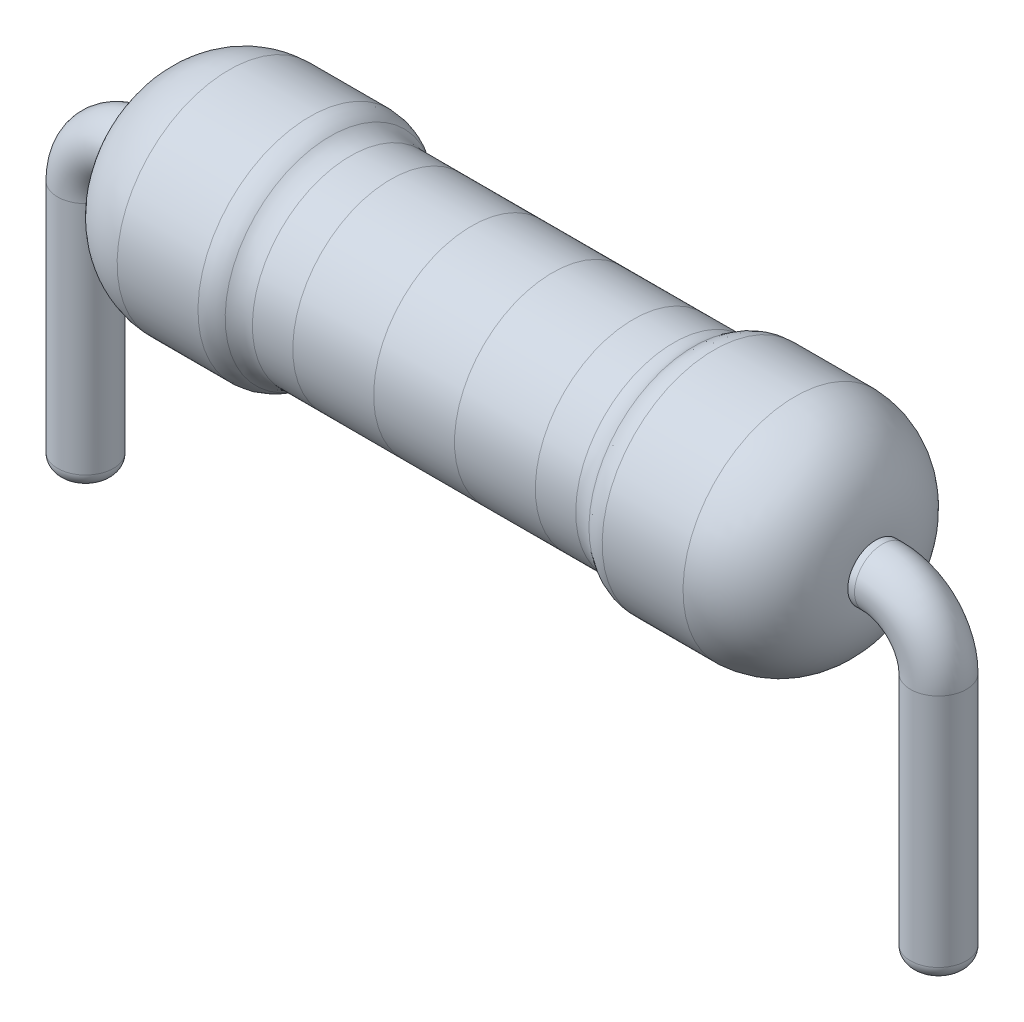
ISO-10303-21;
HEADER;
FILE_DESCRIPTION(('STEP AP214'),'2;1');
FILE_NAME('part.step','',(''),(''),'','','');
FILE_SCHEMA(('AUTOMOTIVE_DESIGN { 1 0 10303 214 1 1 1 1 }'));
ENDSEC;
DATA;
#1=APPLICATION_CONTEXT('core data for automotive mechanical design processes');
#2=APPLICATION_PROTOCOL_DEFINITION('international standard','automotive_design',2000,#1);
#3=PRODUCT_CONTEXT('',#1,'mechanical');
#4=PRODUCT('Part','Part','',(#3));
#5=PRODUCT_RELATED_PRODUCT_CATEGORY('part','',(#4));
#6=PRODUCT_DEFINITION_FORMATION('','',#4);
#7=PRODUCT_DEFINITION_CONTEXT('part definition',#1,'design');
#8=PRODUCT_DEFINITION('design','',#6,#7);
#9=PRODUCT_DEFINITION_SHAPE('','',#8);
#10=(LENGTH_UNIT() NAMED_UNIT(*) SI_UNIT(.MILLI.,.METRE.));
#11=(NAMED_UNIT(*) PLANE_ANGLE_UNIT() SI_UNIT($,.RADIAN.));
#12=(NAMED_UNIT(*) SI_UNIT($,.STERADIAN.) SOLID_ANGLE_UNIT());
#13=UNCERTAINTY_MEASURE_WITH_UNIT(LENGTH_MEASURE(1.E-05),#10,'distance_accuracy_value','');
#14=(GEOMETRIC_REPRESENTATION_CONTEXT(3) GLOBAL_UNCERTAINTY_ASSIGNED_CONTEXT((#13)) GLOBAL_UNIT_ASSIGNED_CONTEXT((#10,
#11,#12)) REPRESENTATION_CONTEXT('',''));
#15=CARTESIAN_POINT('',(0.,0.,0.));
#16=DIRECTION('',(0.,0.,1.));
#17=DIRECTION('',(1.,0.,0.));
#18=AXIS2_PLACEMENT_3D('',#15,#16,#17);
#19=CARTESIAN_POINT('',(-3.25,0.,0.));
#20=DIRECTION('',(-1.,0.,0.));
#21=DIRECTION('',(0.,-1.,0.));
#22=AXIS2_PLACEMENT_3D('',#19,#20,#21);
#23=CYLINDRICAL_SURFACE('',#22,0.875000000000003);
#24=CARTESIAN_POINT('',(0.361111111111111,0.,0.));
#25=DIRECTION('',(1.,0.,0.));
#26=DIRECTION('',(0.,0.,-1.));
#27=AXIS2_PLACEMENT_3D('',#24,#25,#26);
#28=CIRCLE('',#27,0.875000000000003);
#29=CARTESIAN_POINT('',(0.361111111111111,0.,-0.875000000000003));
#30=VERTEX_POINT('',#29);
#31=EDGE_CURVE('E67',#30,#30,#28,.T.);
#32=ORIENTED_EDGE('',*,*,#31,.T.);
#33=EDGE_LOOP('',(#32));
#34=FACE_BOUND('',#33,.T.);
#35=CARTESIAN_POINT('',(1.08333333333333,0.,0.));
#36=DIRECTION('',(1.,0.,0.));
#37=DIRECTION('',(0.,0.,-1.));
#38=AXIS2_PLACEMENT_3D('',#35,#36,#37);
#39=CIRCLE('',#38,0.875000000000003);
#40=CARTESIAN_POINT('',(1.08333333333333,0.,-0.875000000000003));
#41=VERTEX_POINT('',#40);
#42=EDGE_CURVE('E63',#41,#41,#39,.T.);
#43=ORIENTED_EDGE('',*,*,#42,.F.);
#44=EDGE_LOOP('',(#43));
#45=FACE_BOUND('',#44,.T.);
#46=ADVANCED_FACE('F39',(#34,#45),#23,.T.);
#47=CARTESIAN_POINT('',(-0.361111111111111,0.,0.));
#48=DIRECTION('',(1.,0.,0.));
#49=DIRECTION('',(0.,0.,-1.));
#50=AXIS2_PLACEMENT_3D('',#47,#48,#49);
#51=CIRCLE('',#50,0.875000000000003);
#52=CARTESIAN_POINT('',(-0.361111111111111,0.,-0.875000000000003));
#53=VERTEX_POINT('',#52);
#54=EDGE_CURVE('E71',#53,#53,#51,.T.);
#55=ORIENTED_EDGE('',*,*,#54,.T.);
#56=EDGE_LOOP('',(#55));
#57=FACE_BOUND('',#56,.T.);
#58=ORIENTED_EDGE('',*,*,#31,.F.);
#59=EDGE_LOOP('',(#58));
#60=FACE_BOUND('',#59,.T.);
#61=ADVANCED_FACE('F156',(#57,#60),#23,.T.);
#62=CARTESIAN_POINT('',(-1.08333333333333,0.,0.));
#63=DIRECTION('',(1.,0.,0.));
#64=DIRECTION('',(0.,0.,-1.));
#65=AXIS2_PLACEMENT_3D('',#62,#63,#64);
#66=CIRCLE('',#65,0.875000000000003);
#67=CARTESIAN_POINT('',(-1.08333333333333,0.,-0.875000000000003));
#68=VERTEX_POINT('',#67);
#69=EDGE_CURVE('E75',#68,#68,#66,.T.);
#70=ORIENTED_EDGE('',*,*,#69,.T.);
#71=EDGE_LOOP('',(#70));
#72=FACE_BOUND('',#71,.T.);
#73=ORIENTED_EDGE('',*,*,#54,.F.);
#74=EDGE_LOOP('',(#73));
#75=FACE_BOUND('',#74,.T.);
#76=ADVANCED_FACE('F163',(#72,#75),#23,.T.);
#77=CARTESIAN_POINT('',(-1.44444444444444,0.,0.));
#78=DIRECTION('',(-1.,0.,0.));
#79=DIRECTION('',(0.,-1.,0.));
#80=AXIS2_PLACEMENT_3D('',#77,#78,#79);
#81=CIRCLE('',#80,0.875000000000003);
#82=CARTESIAN_POINT('',(-1.44444444444444,-0.875000000000005,0.));
#83=VERTEX_POINT('',#82);
#84=EDGE_CURVE('E95',#83,#83,#81,.T.);
#85=ORIENTED_EDGE('',*,*,#84,.F.);
#86=EDGE_LOOP('',(#85));
#87=FACE_BOUND('',#86,.T.);
#88=ORIENTED_EDGE('',*,*,#69,.F.);
#89=EDGE_LOOP('',(#88));
#90=FACE_BOUND('',#89,.T.);
#91=ADVANCED_FACE('F172',(#87,#90),#23,.T.);
#92=CARTESIAN_POINT('',(2.49946581196582,0.,0.));
#93=DIRECTION('',(-1.,0.,0.));
#94=DIRECTION('',(0.,-1.,0.));
#95=AXIS2_PLACEMENT_3D('',#92,#93,#94);
#96=DEGENERATE_TOROIDAL_SURFACE('',#95,0.250000000000002,0.750534188034192,.T.);
#97=CARTESIAN_POINT('',(2.52777777777779,0.,0.));
#98=DIRECTION('',(-1.,0.,0.));
#99=DIRECTION('',(0.,-1.,0.));
#100=AXIS2_PLACEMENT_3D('',#97,#98,#99);
#101=CIRCLE('',#100,1.00000000000001);
#102=CARTESIAN_POINT('',(2.52777777777779,-1.00000000000001,0.));
#103=VERTEX_POINT('',#102);
#104=EDGE_CURVE('E79',#103,#103,#101,.T.);
#105=ORIENTED_EDGE('',*,*,#104,.F.);
#106=EDGE_LOOP('',(#105));
#107=FACE_BOUND('',#106,.T.);
#108=CARTESIAN_POINT('',(3.25000000000001,0.,0.));
#109=DIRECTION('',(-1.,0.,0.));
#110=DIRECTION('',(0.,-1.,0.));
#111=AXIS2_PLACEMENT_3D('',#108,#109,#110);
#112=CIRCLE('',#111,0.250000000000003);
#113=CARTESIAN_POINT('',(3.25000000000001,-0.250000000000006,0.));
#114=VERTEX_POINT('',#113);
#115=EDGE_CURVE('E115',#114,#114,#112,.F.);
#116=ORIENTED_EDGE('',*,*,#115,.F.);
#117=EDGE_LOOP('',(#116));
#118=FACE_BOUND('',#117,.T.);
#119=ADVANCED_FACE('F183',(#107,#118),#96,.T.);
#120=CARTESIAN_POINT('',(-3.25,0.,0.));
#121=DIRECTION('',(-1.,0.,0.));
#122=DIRECTION('',(0.,-1.,0.));
#123=AXIS2_PLACEMENT_3D('',#120,#121,#122);
#124=CYLINDRICAL_SURFACE('',#123,1.00000000000001);
#125=CARTESIAN_POINT('',(1.80555555555556,0.,0.));
#126=DIRECTION('',(-1.,0.,0.));
#127=DIRECTION('',(0.,-1.,0.));
#128=AXIS2_PLACEMENT_3D('',#125,#126,#127);
#129=CIRCLE('',#128,1.00000000000001);
#130=CARTESIAN_POINT('',(1.80555555555556,-1.00000000000001,0.));
#131=VERTEX_POINT('',#130);
#132=EDGE_CURVE('E83',#131,#131,#129,.T.);
#133=ORIENTED_EDGE('',*,*,#132,.F.);
#134=EDGE_LOOP('',(#133));
#135=FACE_BOUND('',#134,.T.);
#136=ORIENTED_EDGE('',*,*,#104,.T.);
#137=EDGE_LOOP('',(#136));
#138=FACE_BOUND('',#137,.T.);
#139=ADVANCED_FACE('F189',(#135,#138),#124,.T.);
#140=CARTESIAN_POINT('',(1.80555555555556,0.,0.));
#141=DIRECTION('',(-1.,0.,0.));
#142=DIRECTION('',(0.,-1.,0.));
#143=AXIS2_PLACEMENT_3D('',#140,#141,#142);
#144=TOROIDAL_SURFACE('',#143,0.7079475308642,0.292052469135804);
#145=CARTESIAN_POINT('',(1.62500000000001,0.,0.));
#146=DIRECTION('',(-1.,0.,0.));
#147=DIRECTION('',(0.,-1.,0.));
#148=AXIS2_PLACEMENT_3D('',#145,#146,#147);
#149=CIRCLE('',#148,0.937500000000004);
#150=CARTESIAN_POINT('',(1.62500000000001,-0.937500000000006,0.));
#151=VERTEX_POINT('',#150);
#152=EDGE_CURVE('E87',#151,#151,#149,.T.);
#153=ORIENTED_EDGE('',*,*,#152,.F.);
#154=EDGE_LOOP('',(#153));
#155=FACE_BOUND('',#154,.T.);
#156=ORIENTED_EDGE('',*,*,#132,.T.);
#157=EDGE_LOOP('',(#156));
#158=FACE_BOUND('',#157,.T.);
#159=ADVANCED_FACE('F179',(#155,#158),#144,.T.);
#160=CARTESIAN_POINT('',(1.44444444444445,0.,0.));
#161=DIRECTION('',(-1.,0.,0.));
#162=DIRECTION('',(0.,-1.,0.));
#163=AXIS2_PLACEMENT_3D('',#160,#161,#162);
#164=TOROIDAL_SURFACE('',#163,1.16705246913581,0.292052469135803);
#165=CARTESIAN_POINT('',(1.44444444444445,0.,0.));
#166=DIRECTION('',(-1.,0.,0.));
#167=DIRECTION('',(0.,-1.,0.));
#168=AXIS2_PLACEMENT_3D('',#165,#166,#167);
#169=CIRCLE('',#168,0.875000000000003);
#170=CARTESIAN_POINT('',(1.44444444444445,-0.875000000000005,0.));
#171=VERTEX_POINT('',#170);
#172=EDGE_CURVE('E91',#171,#171,#169,.T.);
#173=ORIENTED_EDGE('',*,*,#172,.F.);
#174=EDGE_LOOP('',(#173));
#175=FACE_BOUND('',#174,.T.);
#176=ORIENTED_EDGE('',*,*,#152,.T.);
#177=EDGE_LOOP('',(#176));
#178=FACE_BOUND('',#177,.T.);
#179=ADVANCED_FACE('F170',(#175,#178),#164,.F.);
#180=ORIENTED_EDGE('',*,*,#42,.T.);
#181=EDGE_LOOP('',(#180));
#182=FACE_BOUND('',#181,.T.);
#183=ORIENTED_EDGE('',*,*,#172,.T.);
#184=EDGE_LOOP('',(#183));
#185=FACE_BOUND('',#184,.T.);
#186=ADVANCED_FACE('F159',(#182,#185),#23,.T.);
#187=CARTESIAN_POINT('',(-1.44444444444444,0.,0.));
#188=DIRECTION('',(-1.,0.,0.));
#189=DIRECTION('',(0.,-1.,0.));
#190=AXIS2_PLACEMENT_3D('',#187,#188,#189);
#191=TOROIDAL_SURFACE('',#190,1.16705246913581,0.292052469135803);
#192=CARTESIAN_POINT('',(-1.625,0.,0.));
#193=DIRECTION('',(-1.,0.,0.));
#194=DIRECTION('',(0.,-1.,0.));
#195=AXIS2_PLACEMENT_3D('',#192,#193,#194);
#196=CIRCLE('',#195,0.937500000000003);
#197=CARTESIAN_POINT('',(-1.625,-0.937500000000005,0.));
#198=VERTEX_POINT('',#197);
#199=EDGE_CURVE('E99',#198,#198,#196,.T.);
#200=ORIENTED_EDGE('',*,*,#199,.F.);
#201=EDGE_LOOP('',(#200));
#202=FACE_BOUND('',#201,.T.);
#203=ORIENTED_EDGE('',*,*,#84,.T.);
#204=EDGE_LOOP('',(#203));
#205=FACE_BOUND('',#204,.T.);
#206=ADVANCED_FACE('F169',(#202,#205),#191,.F.);
#207=CARTESIAN_POINT('',(-1.80555555555556,0.,0.));
#208=DIRECTION('',(-1.,0.,0.));
#209=DIRECTION('',(0.,-1.,0.));
#210=AXIS2_PLACEMENT_3D('',#207,#208,#209);
#211=TOROIDAL_SURFACE('',#210,0.7079475308642,0.292052469135804);
#212=CARTESIAN_POINT('',(-1.80555555555556,0.,0.));
#213=DIRECTION('',(-1.,0.,0.));
#214=DIRECTION('',(0.,-1.,0.));
#215=AXIS2_PLACEMENT_3D('',#212,#213,#214);
#216=CIRCLE('',#215,1.);
#217=CARTESIAN_POINT('',(-1.80555555555556,-1.00000000000001,0.));
#218=VERTEX_POINT('',#217);
#219=EDGE_CURVE('E103',#218,#218,#216,.T.);
#220=ORIENTED_EDGE('',*,*,#219,.F.);
#221=EDGE_LOOP('',(#220));
#222=FACE_BOUND('',#221,.T.);
#223=ORIENTED_EDGE('',*,*,#199,.T.);
#224=EDGE_LOOP('',(#223));
#225=FACE_BOUND('',#224,.T.);
#226=ADVANCED_FACE('F177',(#222,#225),#211,.T.);
#227=CARTESIAN_POINT('',(-3.25,0.,0.));
#228=DIRECTION('',(-1.,0.,0.));
#229=DIRECTION('',(0.,-1.,0.));
#230=AXIS2_PLACEMENT_3D('',#227,#228,#229);
#231=CYLINDRICAL_SURFACE('',#230,1.);
#232=CARTESIAN_POINT('',(-2.52777777777778,0.,0.));
#233=DIRECTION('',(-1.,0.,0.));
#234=DIRECTION('',(0.,-1.,0.));
#235=AXIS2_PLACEMENT_3D('',#232,#233,#234);
#236=CIRCLE('',#235,1.00000000000001);
#237=CARTESIAN_POINT('',(-2.52777777777778,-1.00000000000001,0.));
#238=VERTEX_POINT('',#237);
#239=EDGE_CURVE('E107',#238,#238,#236,.T.);
#240=ORIENTED_EDGE('',*,*,#239,.F.);
#241=EDGE_LOOP('',(#240));
#242=FACE_BOUND('',#241,.T.);
#243=ORIENTED_EDGE('',*,*,#219,.T.);
#244=EDGE_LOOP('',(#243));
#245=FACE_BOUND('',#244,.T.);
#246=ADVANCED_FACE('F313',(#242,#245),#231,.T.);
#247=CARTESIAN_POINT('',(-2.49946581196581,0.,0.));
#248=DIRECTION('',(-1.,0.,0.));
#249=DIRECTION('',(0.,-1.,0.));
#250=AXIS2_PLACEMENT_3D('',#247,#248,#249);
#251=DEGENERATE_TOROIDAL_SURFACE('',#250,0.250000000000002,0.750534188034192,.T.);
#252=CARTESIAN_POINT('',(-3.25,0.,0.));
#253=DIRECTION('',(-1.,0.,0.));
#254=DIRECTION('',(0.,-1.,0.));
#255=AXIS2_PLACEMENT_3D('',#252,#253,#254);
#256=CIRCLE('',#255,0.250000000000002);
#257=CARTESIAN_POINT('',(-3.25,-0.250000000000005,0.));
#258=VERTEX_POINT('',#257);
#259=EDGE_CURVE('E111',#258,#258,#256,.T.);
#260=ORIENTED_EDGE('',*,*,#259,.F.);
#261=EDGE_LOOP('',(#260));
#262=FACE_BOUND('',#261,.T.);
#263=ORIENTED_EDGE('',*,*,#239,.T.);
#264=EDGE_LOOP('',(#263));
#265=FACE_BOUND('',#264,.T.);
#266=ADVANCED_FACE('F273',(#262,#265),#251,.T.);
#267=CARTESIAN_POINT('',(-3.81,-2.72500000000001,0.));
#268=DIRECTION('',(0.,1.,0.));
#269=DIRECTION('',(0.,0.,-1.));
#270=AXIS2_PLACEMENT_3D('',#267,#268,#269);
#271=PLANE('',#270);
#272=CARTESIAN_POINT('',(-3.81,-2.72500000000001,0.));
#273=DIRECTION('',(0.,1.,0.));
#274=DIRECTION('',(0.,0.,1.));
#275=AXIS2_PLACEMENT_3D('',#272,#273,#274);
#276=CIRCLE('',#275,0.125000000000003);
#277=CARTESIAN_POINT('',(-3.81,-2.72500000000001,0.125000000000003));
#278=VERTEX_POINT('',#277);
#279=EDGE_CURVE('E52',#278,#278,#276,.F.);
#280=ORIENTED_EDGE('',*,*,#279,.T.);
#281=EDGE_LOOP('',(#280));
#282=FACE_BOUND('',#281,.T.);
#283=ADVANCED_FACE('F269',(#282),#271,.F.);
#284=CARTESIAN_POINT('',(-3.81,-0.500000000000001,0.));
#285=DIRECTION('',(0.,-1.,0.));
#286=DIRECTION('',(0.,0.,-1.));
#287=AXIS2_PLACEMENT_3D('',#284,#285,#286);
#288=CYLINDRICAL_SURFACE('',#287,0.250000000000003);
#289=CARTESIAN_POINT('',(-3.81,-2.60000000000001,0.));
#290=DIRECTION('',(0.,1.,0.));
#291=DIRECTION('',(0.,0.,1.));
#292=AXIS2_PLACEMENT_3D('',#289,#290,#291);
#293=CIRCLE('',#292,0.250000000000003);
#294=CARTESIAN_POINT('',(-3.81,-2.60000000000001,0.250000000000003));
#295=VERTEX_POINT('',#294);
#296=EDGE_CURVE('E57',#295,#295,#293,.T.);
#297=ORIENTED_EDGE('',*,*,#296,.T.);
#298=EDGE_LOOP('',(#297));
#299=FACE_BOUND('',#298,.T.);
#300=CARTESIAN_POINT('',(-3.81,-0.500000000000001,0.));
#301=DIRECTION('',(0.,1.,0.));
#302=DIRECTION('',(0.,0.,-1.));
#303=AXIS2_PLACEMENT_3D('',#300,#301,#302);
#304=CIRCLE('',#303,0.250000000000003);
#305=CARTESIAN_POINT('',(-4.06,-0.5,0.));
#306=VERTEX_POINT('',#305);
#307=EDGE_CURVE('E119',#306,#306,#304,.T.);
#308=ORIENTED_EDGE('',*,*,#307,.F.);
#309=EDGE_LOOP('',(#308));
#310=FACE_BOUND('',#309,.T.);
#311=ADVANCED_FACE('F239',(#299,#310),#288,.T.);
#312=CARTESIAN_POINT('',(-3.31,-0.500000000000001,0.));
#313=DIRECTION('',(0.,0.,1.));
#314=DIRECTION('',(1.,0.,0.));
#315=AXIS2_PLACEMENT_3D('',#312,#313,#314);
#316=TOROIDAL_SURFACE('',#315,0.500000000000001,0.250000000000003);
#317=CARTESIAN_POINT('',(-3.31,0.,0.));
#318=DIRECTION('',(1.,0.,0.));
#319=DIRECTION('',(0.,0.,-1.));
#320=AXIS2_PLACEMENT_3D('',#317,#318,#319);
#321=CIRCLE('',#320,0.250000000000003);
#322=CARTESIAN_POINT('',(-3.31,0.250000000000003,0.));
#323=VERTEX_POINT('',#322);
#324=EDGE_CURVE('E123',#323,#323,#321,.T.);
#325=CARTESIAN_POINT('',(-3.31,-0.500000000000001,0.));
#326=DIRECTION('',(0.,0.,1.));
#327=DIRECTION('',(1.,0.,0.));
#328=AXIS2_PLACEMENT_3D('',#325,#326,#327);
#329=CIRCLE('',#328,0.750000000000004);
#330=EDGE_CURVE('',#323,#306,#329,.T.);
#331=ORIENTED_EDGE('',*,*,#324,.F.);
#332=ORIENTED_EDGE('',*,*,#307,.T.);
#333=ORIENTED_EDGE('',*,*,#330,.T.);
#334=ORIENTED_EDGE('',*,*,#330,.F.);
#335=EDGE_LOOP('',(#331,#333,#332,#334));
#336=FACE_BOUND('',#335,.T.);
#337=ADVANCED_FACE('F234',(#336),#316,.T.);
#338=CARTESIAN_POINT('',(3.31,0.,0.));
#339=DIRECTION('',(-1.,0.,0.));
#340=DIRECTION('',(0.,0.,1.));
#341=AXIS2_PLACEMENT_3D('',#338,#339,#340);
#342=CYLINDRICAL_SURFACE('',#341,0.250000000000003);
#343=ORIENTED_EDGE('',*,*,#324,.T.);
#344=EDGE_LOOP('',(#343));
#345=FACE_BOUND('',#344,.T.);
#346=ORIENTED_EDGE('',*,*,#259,.T.);
#347=EDGE_LOOP('',(#346));
#348=FACE_BOUND('',#347,.T.);
#349=ADVANCED_FACE('F153',(#345,#348),#342,.T.);
#350=CARTESIAN_POINT('',(3.31,0.,0.));
#351=DIRECTION('',(1.,0.,0.));
#352=DIRECTION('',(0.,0.,-1.));
#353=AXIS2_PLACEMENT_3D('',#350,#351,#352);
#354=CIRCLE('',#353,0.250000000000003);
#355=CARTESIAN_POINT('',(3.31,0.250000000000004,0.));
#356=VERTEX_POINT('',#355);
#357=EDGE_CURVE('E127',#356,#356,#354,.T.);
#358=ORIENTED_EDGE('',*,*,#357,.F.);
#359=EDGE_LOOP('',(#358));
#360=FACE_BOUND('',#359,.T.);
#361=ORIENTED_EDGE('',*,*,#115,.T.);
#362=EDGE_LOOP('',(#361));
#363=FACE_BOUND('',#362,.T.);
#364=ADVANCED_FACE('F143',(#360,#363),#342,.T.);
#365=CARTESIAN_POINT('',(3.81,-2.72500000000001,0.));
#366=DIRECTION('',(0.,-1.,0.));
#367=DIRECTION('',(0.,0.,-1.));
#368=AXIS2_PLACEMENT_3D('',#365,#366,#367);
#369=PLANE('',#368);
#370=CARTESIAN_POINT('',(3.81,-2.72500000000001,0.));
#371=DIRECTION('',(0.,-1.,0.));
#372=DIRECTION('',(0.,0.,-1.));
#373=AXIS2_PLACEMENT_3D('',#370,#371,#372);
#374=CIRCLE('',#373,0.125000000000003);
#375=CARTESIAN_POINT('',(3.81,-2.72500000000001,-0.125000000000003));
#376=VERTEX_POINT('',#375);
#377=EDGE_CURVE('E47',#376,#376,#374,.T.);
#378=ORIENTED_EDGE('',*,*,#377,.T.);
#379=EDGE_LOOP('',(#378));
#380=FACE_BOUND('',#379,.T.);
#381=ADVANCED_FACE('F149',(#380),#369,.T.);
#382=CARTESIAN_POINT('',(3.81,-2.72500000000001,0.));
#383=DIRECTION('',(0.,1.,0.));
#384=DIRECTION('',(0.,0.,1.));
#385=AXIS2_PLACEMENT_3D('',#382,#383,#384);
#386=CYLINDRICAL_SURFACE('',#385,0.250000000000003);
#387=CARTESIAN_POINT('',(3.81,-2.60000000000001,0.));
#388=DIRECTION('',(0.,-1.,0.));
#389=DIRECTION('',(0.,0.,-1.));
#390=AXIS2_PLACEMENT_3D('',#387,#388,#389);
#391=CIRCLE('',#390,0.250000000000003);
#392=CARTESIAN_POINT('',(3.81,-2.60000000000001,-0.250000000000003));
#393=VERTEX_POINT('',#392);
#394=EDGE_CURVE('E10',#393,#393,#391,.F.);
#395=ORIENTED_EDGE('',*,*,#394,.T.);
#396=EDGE_LOOP('',(#395));
#397=FACE_BOUND('',#396,.T.);
#398=CARTESIAN_POINT('',(3.81,-0.500000000000001,0.));
#399=DIRECTION('',(0.,-1.,0.));
#400=DIRECTION('',(0.,0.,-1.));
#401=AXIS2_PLACEMENT_3D('',#398,#399,#400);
#402=CIRCLE('',#401,0.250000000000003);
#403=CARTESIAN_POINT('',(4.06,-0.5,0.));
#404=VERTEX_POINT('',#403);
#405=EDGE_CURVE('E131',#404,#404,#402,.T.);
#406=ORIENTED_EDGE('',*,*,#405,.T.);
#407=EDGE_LOOP('',(#406));
#408=FACE_BOUND('',#407,.T.);
#409=ADVANCED_FACE('F136',(#397,#408),#386,.T.);
#410=CARTESIAN_POINT('',(3.31,-0.500000000000001,0.));
#411=DIRECTION('',(0.,0.,1.));
#412=DIRECTION('',(1.,0.,0.));
#413=AXIS2_PLACEMENT_3D('',#410,#411,#412);
#414=TOROIDAL_SURFACE('',#413,0.500000000000001,0.250000000000003);
#415=CARTESIAN_POINT('',(3.31,-0.500000000000001,0.));
#416=DIRECTION('',(0.,0.,1.));
#417=DIRECTION('',(1.,0.,0.));
#418=AXIS2_PLACEMENT_3D('',#415,#416,#417);
#419=CIRCLE('',#418,0.750000000000004);
#420=EDGE_CURVE('',#404,#356,#419,.T.);
#421=ORIENTED_EDGE('',*,*,#405,.F.);
#422=ORIENTED_EDGE('',*,*,#357,.T.);
#423=ORIENTED_EDGE('',*,*,#420,.T.);
#424=ORIENTED_EDGE('',*,*,#420,.F.);
#425=EDGE_LOOP('',(#421,#423,#422,#424));
#426=FACE_BOUND('',#425,.T.);
#427=ADVANCED_FACE('F138',(#426),#414,.T.);
#428=CARTESIAN_POINT('',(-3.81,-2.60000000000001,0.));
#429=DIRECTION('',(0.,1.,0.));
#430=DIRECTION('',(0.,0.,1.));
#431=AXIS2_PLACEMENT_3D('',#428,#429,#430);
#432=TOROIDAL_SURFACE('',#431,0.125000000000003,0.125);
#433=ORIENTED_EDGE('',*,*,#279,.F.);
#434=EDGE_LOOP('',(#433));
#435=FACE_BOUND('',#434,.T.);
#436=ORIENTED_EDGE('',*,*,#296,.F.);
#437=EDGE_LOOP('',(#436));
#438=FACE_BOUND('',#437,.T.);
#439=ADVANCED_FACE('F140',(#435,#438),#432,.T.);
#440=CARTESIAN_POINT('',(3.81,-2.60000000000001,0.));
#441=DIRECTION('',(0.,-1.,0.));
#442=DIRECTION('',(0.,0.,-1.));
#443=AXIS2_PLACEMENT_3D('',#440,#441,#442);
#444=TOROIDAL_SURFACE('',#443,0.125000000000003,0.125);
#445=ORIENTED_EDGE('',*,*,#394,.F.);
#446=EDGE_LOOP('',(#445));
#447=FACE_BOUND('',#446,.T.);
#448=ORIENTED_EDGE('',*,*,#377,.F.);
#449=EDGE_LOOP('',(#448));
#450=FACE_BOUND('',#449,.T.);
#451=ADVANCED_FACE('F41',(#447,#450),#444,.T.);
#452=CLOSED_SHELL('',(#46,#61,#76,#91,#119,#139,#159,#179,#186,#206,#226,#246,#266,#283,#311,
#337,#349,#364,#381,#409,#427,#439,#451));
#453=MANIFOLD_SOLID_BREP('B2',#452);
#454=ADVANCED_BREP_SHAPE_REPRESENTATION('',(#18,#453),#14);
#455=SHAPE_DEFINITION_REPRESENTATION(#9,#454);
ENDSEC;
END-ISO-10303-21;
